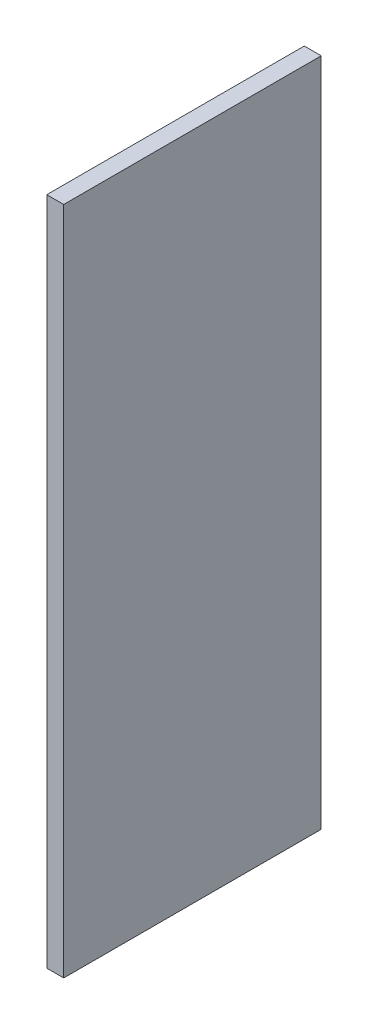
ISO-10303-21;
HEADER;
FILE_DESCRIPTION(('STEP AP214'),'2;1');
FILE_NAME('part.step','',(''),(''),'','','');
FILE_SCHEMA(('AUTOMOTIVE_DESIGN { 1 0 10303 214 1 1 1 1 }'));
ENDSEC;
DATA;
#1=APPLICATION_CONTEXT('core data for automotive mechanical design processes');
#2=APPLICATION_PROTOCOL_DEFINITION('international standard','automotive_design',2000,#1);
#3=PRODUCT_CONTEXT('',#1,'mechanical');
#4=PRODUCT('Part','Part','',(#3));
#5=PRODUCT_RELATED_PRODUCT_CATEGORY('part','',(#4));
#6=PRODUCT_DEFINITION_FORMATION('','',#4);
#7=PRODUCT_DEFINITION_CONTEXT('part definition',#1,'design');
#8=PRODUCT_DEFINITION('design','',#6,#7);
#9=PRODUCT_DEFINITION_SHAPE('','',#8);
#10=(LENGTH_UNIT() NAMED_UNIT(*) SI_UNIT(.MILLI.,.METRE.));
#11=(NAMED_UNIT(*) PLANE_ANGLE_UNIT() SI_UNIT($,.RADIAN.));
#12=(NAMED_UNIT(*) SI_UNIT($,.STERADIAN.) SOLID_ANGLE_UNIT());
#13=UNCERTAINTY_MEASURE_WITH_UNIT(LENGTH_MEASURE(1.E-05),#10,'distance_accuracy_value','');
#14=(GEOMETRIC_REPRESENTATION_CONTEXT(3) GLOBAL_UNCERTAINTY_ASSIGNED_CONTEXT((#13)) GLOBAL_UNIT_ASSIGNED_CONTEXT((#10,
#11,#12)) REPRESENTATION_CONTEXT('',''));
#15=CARTESIAN_POINT('',(0.,0.,0.));
#16=DIRECTION('',(0.,0.,1.));
#17=DIRECTION('',(1.,0.,0.));
#18=AXIS2_PLACEMENT_3D('',#15,#16,#17);
#19=CARTESIAN_POINT('',(-40.,50.9279701386724,30.5));
#20=DIRECTION('',(-1.,0.,0.));
#21=DIRECTION('',(0.,0.,1.));
#22=AXIS2_PLACEMENT_3D('',#19,#20,#21);
#23=PLANE('',#22);
#24=DIRECTION('',(0.,1.,0.));
#25=VECTOR('',#24,1.);
#26=CARTESIAN_POINT('',(-40.,0.,40.));
#27=LINE('',#26,#25);
#28=CARTESIAN_POINT('',(-40.,3.,40.));
#29=VERTEX_POINT('',#28);
#30=CARTESIAN_POINT('',(-40.,101.855940277345,40.));
#31=VERTEX_POINT('',#30);
#32=EDGE_CURVE('E84',#29,#31,#27,.T.);
#33=ORIENTED_EDGE('',*,*,#32,.F.);
#34=DIRECTION('',(0.,0.,1.));
#35=VECTOR('',#34,1.);
#36=CARTESIAN_POINT('',(-40.,3.,40.));
#37=LINE('',#36,#35);
#38=CARTESIAN_POINT('',(-40.,3.,2.));
#39=VERTEX_POINT('',#38);
#40=EDGE_CURVE('E94',#39,#29,#37,.T.);
#41=ORIENTED_EDGE('',*,*,#40,.F.);
#42=DIRECTION('',(0.,-1.,0.));
#43=VECTOR('',#42,1.);
#44=CARTESIAN_POINT('',(-40.,101.855940277345,2.));
#45=LINE('',#44,#43);
#46=CARTESIAN_POINT('',(-40.,101.855940277345,2.));
#47=VERTEX_POINT('',#46);
#48=EDGE_CURVE('E83',#47,#39,#45,.T.);
#49=ORIENTED_EDGE('',*,*,#48,.F.);
#50=DIRECTION('',(0.,0.,-1.));
#51=VECTOR('',#50,1.);
#52=CARTESIAN_POINT('',(-40.,101.855940277345,40.));
#53=LINE('',#52,#51);
#54=EDGE_CURVE('E73',#31,#47,#53,.T.);
#55=ORIENTED_EDGE('',*,*,#54,.F.);
#56=EDGE_LOOP('',(#33,#41,#49,#55));
#57=FACE_BOUND('',#56,.T.);
#58=ADVANCED_FACE('F37',(#57),#23,.F.);
#59=CARTESIAN_POINT('',(-42.5,0.,0.));
#60=DIRECTION('',(-1.,0.,0.));
#61=DIRECTION('',(0.,0.,1.));
#62=AXIS2_PLACEMENT_3D('',#59,#60,#61);
#63=PLANE('',#62);
#64=CARTESIAN_POINT('',(-42.5,50.9279701386724,11.5));
#65=DIRECTION('',(-1.,0.,0.));
#66=DIRECTION('',(0.,0.,1.));
#67=AXIS2_PLACEMENT_3D('',#64,#65,#66);
#68=CIRCLE('',#67,1.5);
#69=CARTESIAN_POINT('',(-42.5,50.9279701386724,13.));
#70=VERTEX_POINT('',#69);
#71=EDGE_CURVE('E110',#70,#70,#68,.T.);
#72=ORIENTED_EDGE('',*,*,#71,.T.);
#73=EDGE_LOOP('',(#72));
#74=FACE_BOUND('',#73,.T.);
#75=ADVANCED_FACE('F147',(#74),#63,.T.);
#76=CARTESIAN_POINT('',(-42.5,50.9279701386724,30.5));
#77=DIRECTION('',(-1.,0.,0.));
#78=DIRECTION('',(0.,0.,1.));
#79=AXIS2_PLACEMENT_3D('',#76,#77,#78);
#80=CIRCLE('',#79,1.5);
#81=CARTESIAN_POINT('',(-42.5,50.9279701386724,32.));
#82=VERTEX_POINT('',#81);
#83=EDGE_CURVE('E45',#82,#82,#80,.T.);
#84=ORIENTED_EDGE('',*,*,#83,.T.);
#85=EDGE_LOOP('',(#84));
#86=FACE_BOUND('',#85,.T.);
#87=ADVANCED_FACE('F124',(#86),#63,.T.);
#88=CARTESIAN_POINT('',(-47.5,50.9279701386724,11.5));
#89=DIRECTION('',(1.,0.,0.));
#90=DIRECTION('',(0.,0.,-1.));
#91=AXIS2_PLACEMENT_3D('',#88,#89,#90);
#92=CYLINDRICAL_SURFACE('',#91,1.5);
#93=ORIENTED_EDGE('',*,*,#71,.F.);
#94=EDGE_LOOP('',(#93));
#95=FACE_BOUND('',#94,.T.);
#96=CARTESIAN_POINT('',(-47.5,50.9279701386724,11.5));
#97=DIRECTION('',(-1.,0.,0.));
#98=DIRECTION('',(0.,0.,1.));
#99=AXIS2_PLACEMENT_3D('',#96,#97,#98);
#100=CIRCLE('',#99,1.5);
#101=CARTESIAN_POINT('',(-47.5,50.9279701386724,13.));
#102=VERTEX_POINT('',#101);
#103=EDGE_CURVE('E104',#102,#102,#100,.T.);
#104=ORIENTED_EDGE('',*,*,#103,.T.);
#105=EDGE_LOOP('',(#104));
#106=FACE_BOUND('',#105,.T.);
#107=ADVANCED_FACE('F130',(#95,#106),#92,.F.);
#108=CARTESIAN_POINT('',(-47.5,50.9279701386724,30.5));
#109=DIRECTION('',(1.,0.,0.));
#110=DIRECTION('',(0.,0.,-1.));
#111=AXIS2_PLACEMENT_3D('',#108,#109,#110);
#112=CYLINDRICAL_SURFACE('',#111,1.5);
#113=ORIENTED_EDGE('',*,*,#83,.F.);
#114=EDGE_LOOP('',(#113));
#115=FACE_BOUND('',#114,.T.);
#116=CARTESIAN_POINT('',(-47.5,50.9279701386724,30.5));
#117=DIRECTION('',(-1.,0.,0.));
#118=DIRECTION('',(0.,0.,1.));
#119=AXIS2_PLACEMENT_3D('',#116,#117,#118);
#120=CIRCLE('',#119,1.5);
#121=CARTESIAN_POINT('',(-47.5,50.9279701386724,32.));
#122=VERTEX_POINT('',#121);
#123=EDGE_CURVE('E116',#122,#122,#120,.T.);
#124=ORIENTED_EDGE('',*,*,#123,.T.);
#125=EDGE_LOOP('',(#124));
#126=FACE_BOUND('',#125,.T.);
#127=ADVANCED_FACE('F126',(#115,#126),#112,.F.);
#128=CARTESIAN_POINT('',(-47.5,50.9279701386724,11.5));
#129=DIRECTION('',(-1.,0.,0.));
#130=DIRECTION('',(0.,0.,1.));
#131=AXIS2_PLACEMENT_3D('',#128,#129,#130);
#132=PLANE('',#131);
#133=CARTESIAN_POINT('',(-47.5,50.9279701386724,11.5));
#134=DIRECTION('',(-1.,0.,0.));
#135=DIRECTION('',(0.,0.,1.));
#136=AXIS2_PLACEMENT_3D('',#133,#134,#135);
#137=CIRCLE('',#136,3.);
#138=CARTESIAN_POINT('',(-47.5,50.9279701386724,14.5));
#139=VERTEX_POINT('',#138);
#140=EDGE_CURVE('E107',#139,#139,#137,.T.);
#141=ORIENTED_EDGE('',*,*,#140,.T.);
#142=EDGE_LOOP('',(#141));
#143=FACE_BOUND('',#142,.T.);
#144=ORIENTED_EDGE('',*,*,#103,.F.);
#145=EDGE_LOOP('',(#144));
#146=FACE_BOUND('',#145,.T.);
#147=ADVANCED_FACE('F129',(#143,#146),#132,.T.);
#148=CARTESIAN_POINT('',(-47.5,50.9279701386724,30.5));
#149=DIRECTION('',(-1.,0.,0.));
#150=DIRECTION('',(0.,0.,1.));
#151=AXIS2_PLACEMENT_3D('',#148,#149,#150);
#152=PLANE('',#151);
#153=CARTESIAN_POINT('',(-47.5,50.9279701386724,30.5));
#154=DIRECTION('',(-1.,0.,0.));
#155=DIRECTION('',(0.,0.,1.));
#156=AXIS2_PLACEMENT_3D('',#153,#154,#155);
#157=CIRCLE('',#156,3.);
#158=CARTESIAN_POINT('',(-47.5,50.9279701386724,33.5));
#159=VERTEX_POINT('',#158);
#160=EDGE_CURVE('E119',#159,#159,#157,.T.);
#161=ORIENTED_EDGE('',*,*,#160,.T.);
#162=EDGE_LOOP('',(#161));
#163=FACE_BOUND('',#162,.T.);
#164=ORIENTED_EDGE('',*,*,#123,.F.);
#165=EDGE_LOOP('',(#164));
#166=FACE_BOUND('',#165,.T.);
#167=ADVANCED_FACE('F134',(#163,#166),#152,.T.);
#168=CARTESIAN_POINT('',(-47.5,50.9279701386724,11.5));
#169=DIRECTION('',(1.,0.,0.));
#170=DIRECTION('',(0.,0.,-1.));
#171=AXIS2_PLACEMENT_3D('',#168,#169,#170);
#172=CYLINDRICAL_SURFACE('',#171,3.);
#173=CARTESIAN_POINT('',(-42.5,50.9279701386724,11.5));
#174=DIRECTION('',(-1.,0.,0.));
#175=DIRECTION('',(0.,0.,1.));
#176=AXIS2_PLACEMENT_3D('',#173,#174,#175);
#177=CIRCLE('',#176,3.);
#178=CARTESIAN_POINT('',(-42.5,50.9279701386724,14.5));
#179=VERTEX_POINT('',#178);
#180=EDGE_CURVE('E101',#179,#179,#177,.T.);
#181=ORIENTED_EDGE('',*,*,#180,.T.);
#182=EDGE_LOOP('',(#181));
#183=FACE_BOUND('',#182,.T.);
#184=ORIENTED_EDGE('',*,*,#140,.F.);
#185=EDGE_LOOP('',(#184));
#186=FACE_BOUND('',#185,.T.);
#187=ADVANCED_FACE('F136',(#183,#186),#172,.T.);
#188=CARTESIAN_POINT('',(-47.5,50.9279701386724,30.5));
#189=DIRECTION('',(1.,0.,0.));
#190=DIRECTION('',(0.,0.,-1.));
#191=AXIS2_PLACEMENT_3D('',#188,#189,#190);
#192=CYLINDRICAL_SURFACE('',#191,3.);
#193=CARTESIAN_POINT('',(-42.5,50.9279701386724,30.5));
#194=DIRECTION('',(-1.,0.,0.));
#195=DIRECTION('',(0.,0.,1.));
#196=AXIS2_PLACEMENT_3D('',#193,#194,#195);
#197=CIRCLE('',#196,3.);
#198=CARTESIAN_POINT('',(-42.5,50.9279701386724,33.5));
#199=VERTEX_POINT('',#198);
#200=EDGE_CURVE('E113',#199,#199,#197,.T.);
#201=ORIENTED_EDGE('',*,*,#200,.T.);
#202=EDGE_LOOP('',(#201));
#203=FACE_BOUND('',#202,.T.);
#204=ORIENTED_EDGE('',*,*,#160,.F.);
#205=EDGE_LOOP('',(#204));
#206=FACE_BOUND('',#205,.T.);
#207=ADVANCED_FACE('F39',(#203,#206),#192,.T.);
#208=CARTESIAN_POINT('',(-42.5,0.,40.));
#209=DIRECTION('',(0.,0.,-1.));
#210=DIRECTION('',(-1.,0.,0.));
#211=AXIS2_PLACEMENT_3D('',#208,#209,#210);
#212=PLANE('',#211);
#213=DIRECTION('',(0.,1.,0.));
#214=VECTOR('',#213,1.);
#215=CARTESIAN_POINT('',(-42.5,0.,40.));
#216=LINE('',#215,#214);
#217=CARTESIAN_POINT('',(-42.5,3.,40.));
#218=VERTEX_POINT('',#217);
#219=CARTESIAN_POINT('',(-42.5,101.855940277345,40.));
#220=VERTEX_POINT('',#219);
#221=EDGE_CURVE('E95',#218,#220,#216,.T.);
#222=ORIENTED_EDGE('',*,*,#221,.F.);
#223=DIRECTION('',(1.,0.,0.));
#224=VECTOR('',#223,1.);
#225=CARTESIAN_POINT('',(-50.,3.,40.));
#226=LINE('',#225,#224);
#227=EDGE_CURVE('E297',#218,#29,#226,.T.);
#228=ORIENTED_EDGE('',*,*,#227,.T.);
#229=ORIENTED_EDGE('',*,*,#32,.T.);
#230=DIRECTION('',(1.,0.,0.));
#231=VECTOR('',#230,1.);
#232=CARTESIAN_POINT('',(-42.5,101.855940277345,40.));
#233=LINE('',#232,#231);
#234=EDGE_CURVE('E79',#220,#31,#233,.T.);
#235=ORIENTED_EDGE('',*,*,#234,.F.);
#236=EDGE_LOOP('',(#222,#228,#229,#235));
#237=FACE_BOUND('',#236,.T.);
#238=ADVANCED_FACE('F160',(#237),#212,.F.);
#239=DIRECTION('',(0.,0.,-1.));
#240=VECTOR('',#239,1.);
#241=CARTESIAN_POINT('',(-42.5,3.,0.));
#242=LINE('',#241,#240);
#243=CARTESIAN_POINT('',(-42.5,3.,2.));
#244=VERTEX_POINT('',#243);
#245=EDGE_CURVE('E52',#218,#244,#242,.T.);
#246=ORIENTED_EDGE('',*,*,#245,.F.);
#247=ORIENTED_EDGE('',*,*,#221,.T.);
#248=DIRECTION('',(0.,0.,-1.));
#249=VECTOR('',#248,1.);
#250=CARTESIAN_POINT('',(-42.5,101.855940277345,40.));
#251=LINE('',#250,#249);
#252=CARTESIAN_POINT('',(-42.5,101.855940277345,2.));
#253=VERTEX_POINT('',#252);
#254=EDGE_CURVE('E60',#220,#253,#251,.T.);
#255=ORIENTED_EDGE('',*,*,#254,.T.);
#256=DIRECTION('',(0.,-1.,0.));
#257=VECTOR('',#256,1.);
#258=CARTESIAN_POINT('',(-42.5,101.855940277345,2.));
#259=LINE('',#258,#257);
#260=EDGE_CURVE('E90',#253,#244,#259,.T.);
#261=ORIENTED_EDGE('',*,*,#260,.T.);
#262=EDGE_LOOP('',(#246,#247,#255,#261));
#263=FACE_BOUND('',#262,.T.);
#264=ORIENTED_EDGE('',*,*,#200,.F.);
#265=EDGE_LOOP('',(#264));
#266=FACE_BOUND('',#265,.T.);
#267=ORIENTED_EDGE('',*,*,#180,.F.);
#268=EDGE_LOOP('',(#267));
#269=FACE_BOUND('',#268,.T.);
#270=ADVANCED_FACE('F151',(#263,#266,#269),#63,.T.);
#271=CARTESIAN_POINT('',(-42.5,101.855940277345,2.));
#272=DIRECTION('',(0.,0.,1.));
#273=DIRECTION('',(1.,0.,0.));
#274=AXIS2_PLACEMENT_3D('',#271,#272,#273);
#275=PLANE('',#274);
#276=ORIENTED_EDGE('',*,*,#48,.T.);
#277=DIRECTION('',(-1.,0.,0.));
#278=VECTOR('',#277,1.);
#279=CARTESIAN_POINT('',(-42.5,3.,2.));
#280=LINE('',#279,#278);
#281=EDGE_CURVE('E11',#39,#244,#280,.T.);
#282=ORIENTED_EDGE('',*,*,#281,.T.);
#283=ORIENTED_EDGE('',*,*,#260,.F.);
#284=DIRECTION('',(1.,0.,0.));
#285=VECTOR('',#284,1.);
#286=CARTESIAN_POINT('',(-42.5,101.855940277345,2.));
#287=LINE('',#286,#285);
#288=EDGE_CURVE('E76',#253,#47,#287,.T.);
#289=ORIENTED_EDGE('',*,*,#288,.T.);
#290=EDGE_LOOP('',(#276,#282,#283,#289));
#291=FACE_BOUND('',#290,.T.);
#292=ADVANCED_FACE('F88',(#291),#275,.F.);
#293=CARTESIAN_POINT('',(-42.5,101.855940277345,40.));
#294=DIRECTION('',(0.,-1.,0.));
#295=DIRECTION('',(0.,0.,-1.));
#296=AXIS2_PLACEMENT_3D('',#293,#294,#295);
#297=PLANE('',#296);
#298=ORIENTED_EDGE('',*,*,#54,.T.);
#299=ORIENTED_EDGE('',*,*,#288,.F.);
#300=ORIENTED_EDGE('',*,*,#254,.F.);
#301=ORIENTED_EDGE('',*,*,#234,.T.);
#302=EDGE_LOOP('',(#298,#299,#300,#301));
#303=FACE_BOUND('',#302,.T.);
#304=ADVANCED_FACE('F75',(#303),#297,.F.);
#305=CARTESIAN_POINT('',(-50.,3.,40.));
#306=DIRECTION('',(0.,1.,0.));
#307=DIRECTION('',(0.,0.,1.));
#308=AXIS2_PLACEMENT_3D('',#305,#306,#307);
#309=PLANE('',#308);
#310=ORIENTED_EDGE('',*,*,#245,.T.);
#311=ORIENTED_EDGE('',*,*,#281,.F.);
#312=ORIENTED_EDGE('',*,*,#40,.T.);
#313=ORIENTED_EDGE('',*,*,#227,.F.);
#314=EDGE_LOOP('',(#310,#311,#312,#313));
#315=FACE_BOUND('',#314,.T.);
#316=ADVANCED_FACE('F156',(#315),#309,.F.);
#317=CLOSED_SHELL('',(#58,#75,#87,#107,#127,#147,#167,#187,#207,#238,#270,#292,#304,#316));
#318=MANIFOLD_SOLID_BREP('B2',#317);
#319=ADVANCED_BREP_SHAPE_REPRESENTATION('',(#18,#318),#14);
#320=SHAPE_DEFINITION_REPRESENTATION(#9,#319);
ENDSEC;
END-ISO-10303-21;
